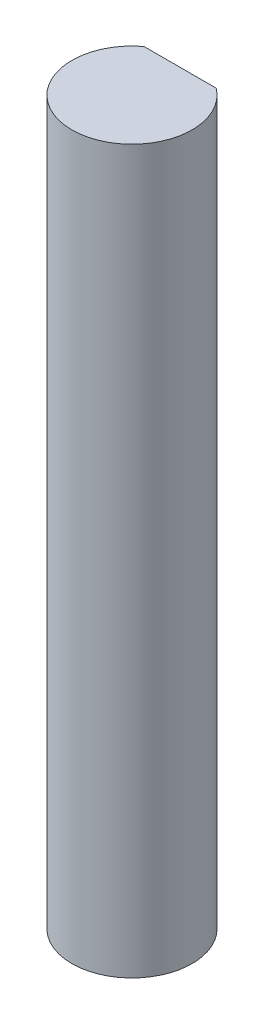
ISO-10303-21;
HEADER;
FILE_DESCRIPTION(('STEP AP214'),'2;1');
FILE_NAME('part.step','',(''),(''),'','','');
FILE_SCHEMA(('AUTOMOTIVE_DESIGN { 1 0 10303 214 1 1 1 1 }'));
ENDSEC;
DATA;
#1=APPLICATION_CONTEXT('core data for automotive mechanical design processes');
#2=APPLICATION_PROTOCOL_DEFINITION('international standard','automotive_design',2000,#1);
#3=PRODUCT_CONTEXT('',#1,'mechanical');
#4=PRODUCT('Part','Part','',(#3));
#5=PRODUCT_RELATED_PRODUCT_CATEGORY('part','',(#4));
#6=PRODUCT_DEFINITION_FORMATION('','',#4);
#7=PRODUCT_DEFINITION_CONTEXT('part definition',#1,'design');
#8=PRODUCT_DEFINITION('design','',#6,#7);
#9=PRODUCT_DEFINITION_SHAPE('','',#8);
#10=(LENGTH_UNIT() NAMED_UNIT(*) SI_UNIT(.MILLI.,.METRE.));
#11=(NAMED_UNIT(*) PLANE_ANGLE_UNIT() SI_UNIT($,.RADIAN.));
#12=(NAMED_UNIT(*) SI_UNIT($,.STERADIAN.) SOLID_ANGLE_UNIT());
#13=UNCERTAINTY_MEASURE_WITH_UNIT(LENGTH_MEASURE(1.E-05),#10,'distance_accuracy_value','');
#14=(GEOMETRIC_REPRESENTATION_CONTEXT(3) GLOBAL_UNCERTAINTY_ASSIGNED_CONTEXT((#13)) GLOBAL_UNIT_ASSIGNED_CONTEXT((#10,
#11,#12)) REPRESENTATION_CONTEXT('',''));
#15=CARTESIAN_POINT('',(0.,0.,0.));
#16=DIRECTION('',(0.,0.,1.));
#17=DIRECTION('',(1.,0.,0.));
#18=AXIS2_PLACEMENT_3D('',#15,#16,#17);
#19=CARTESIAN_POINT('',(0.,30.,0.));
#20=DIRECTION('',(0.,-1.,0.));
#21=DIRECTION('',(0.,0.,-1.));
#22=AXIS2_PLACEMENT_3D('',#19,#20,#21);
#23=CYLINDRICAL_SURFACE('',#22,2.5);
#24=CARTESIAN_POINT('',(0.,0.,0.));
#25=DIRECTION('',(0.,1.,0.));
#26=DIRECTION('',(0.,0.,1.));
#27=AXIS2_PLACEMENT_3D('',#24,#25,#26);
#28=CIRCLE('',#27,2.5);
#29=CARTESIAN_POINT('',(-1.5,0.,-2.));
#30=VERTEX_POINT('',#29);
#31=CARTESIAN_POINT('',(1.5,0.,-2.));
#32=VERTEX_POINT('',#31);
#33=EDGE_CURVE('E72',#30,#32,#28,.T.);
#34=ORIENTED_EDGE('',*,*,#33,.T.);
#35=DIRECTION('',(0.,-1.,0.));
#36=VECTOR('',#35,1.);
#37=CARTESIAN_POINT('',(1.5,30.,-2.));
#38=LINE('',#37,#36);
#39=CARTESIAN_POINT('',(1.5,30.,-2.));
#40=VERTEX_POINT('',#39);
#41=EDGE_CURVE('E11',#40,#32,#38,.T.);
#42=ORIENTED_EDGE('',*,*,#41,.F.);
#43=CARTESIAN_POINT('',(0.,30.,0.));
#44=DIRECTION('',(0.,1.,0.));
#45=DIRECTION('',(0.,0.,1.));
#46=AXIS2_PLACEMENT_3D('',#43,#44,#45);
#47=CIRCLE('',#46,2.5);
#48=CARTESIAN_POINT('',(-1.5,30.,-2.));
#49=VERTEX_POINT('',#48);
#50=EDGE_CURVE('E74',#49,#40,#47,.T.);
#51=ORIENTED_EDGE('',*,*,#50,.F.);
#52=DIRECTION('',(0.,-1.,0.));
#53=VECTOR('',#52,1.);
#54=CARTESIAN_POINT('',(-1.5,30.,-2.));
#55=LINE('',#54,#53);
#56=EDGE_CURVE('E56',#49,#30,#55,.T.);
#57=ORIENTED_EDGE('',*,*,#56,.T.);
#58=EDGE_LOOP('',(#34,#42,#51,#57));
#59=FACE_BOUND('',#58,.T.);
#60=ADVANCED_FACE('F47',(#59),#23,.T.);
#61=CARTESIAN_POINT('',(0.,30.,-2.));
#62=DIRECTION('',(0.,0.,-1.));
#63=DIRECTION('',(-1.,0.,0.));
#64=AXIS2_PLACEMENT_3D('',#61,#62,#63);
#65=PLANE('',#64);
#66=DIRECTION('',(1.,0.,0.));
#67=VECTOR('',#66,1.);
#68=CARTESIAN_POINT('',(0.,0.,-2.));
#69=LINE('',#68,#67);
#70=EDGE_CURVE('E80',#30,#32,#69,.T.);
#71=ORIENTED_EDGE('',*,*,#70,.F.);
#72=ORIENTED_EDGE('',*,*,#56,.F.);
#73=DIRECTION('',(1.,0.,0.));
#74=VECTOR('',#73,1.);
#75=CARTESIAN_POINT('',(0.,30.,-2.));
#76=LINE('',#75,#74);
#77=EDGE_CURVE('E77',#49,#40,#76,.T.);
#78=ORIENTED_EDGE('',*,*,#77,.T.);
#79=ORIENTED_EDGE('',*,*,#41,.T.);
#80=EDGE_LOOP('',(#71,#72,#78,#79));
#81=FACE_BOUND('',#80,.T.);
#82=ADVANCED_FACE('F83',(#81),#65,.T.);
#83=CARTESIAN_POINT('',(0.,30.,0.));
#84=DIRECTION('',(0.,1.,0.));
#85=DIRECTION('',(0.,0.,1.));
#86=AXIS2_PLACEMENT_3D('',#83,#84,#85);
#87=PLANE('',#86);
#88=ORIENTED_EDGE('',*,*,#50,.T.);
#89=ORIENTED_EDGE('',*,*,#77,.F.);
#90=EDGE_LOOP('',(#88,#89));
#91=FACE_BOUND('',#90,.T.);
#92=ADVANCED_FACE('F91',(#91),#87,.T.);
#93=CARTESIAN_POINT('',(0.,0.,0.));
#94=DIRECTION('',(0.,1.,0.));
#95=DIRECTION('',(0.,0.,1.));
#96=AXIS2_PLACEMENT_3D('',#93,#94,#95);
#97=PLANE('',#96);
#98=ORIENTED_EDGE('',*,*,#33,.F.);
#99=ORIENTED_EDGE('',*,*,#70,.T.);
#100=EDGE_LOOP('',(#98,#99));
#101=FACE_BOUND('',#100,.T.);
#102=ADVANCED_FACE('F79',(#101),#97,.F.);
#103=CLOSED_SHELL('',(#60,#82,#92,#102));
#104=MANIFOLD_SOLID_BREP('B2',#103);
#105=ADVANCED_BREP_SHAPE_REPRESENTATION('',(#18,#104),#14);
#106=SHAPE_DEFINITION_REPRESENTATION(#9,#105);
ENDSEC;
END-ISO-10303-21;
